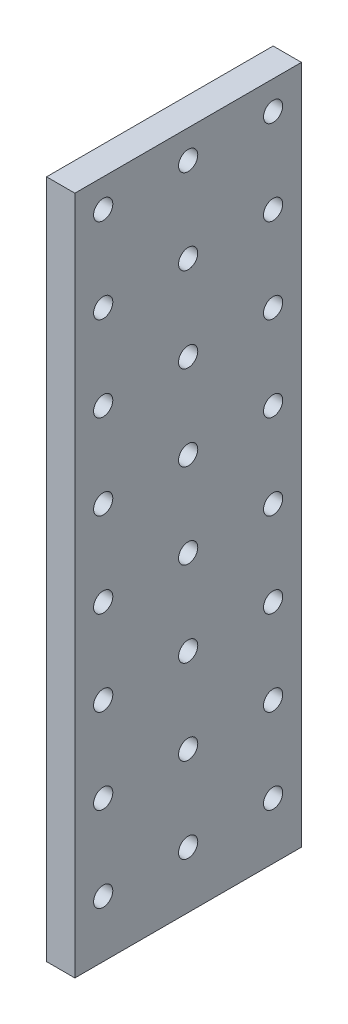
ISO-10303-21;
HEADER;
FILE_DESCRIPTION(('STEP AP214'),'2;1');
FILE_NAME('part.step','',(''),(''),'','','');
FILE_SCHEMA(('AUTOMOTIVE_DESIGN { 1 0 10303 214 1 1 1 1 }'));
ENDSEC;
DATA;
#1=APPLICATION_CONTEXT('core data for automotive mechanical design processes');
#2=APPLICATION_PROTOCOL_DEFINITION('international standard','automotive_design',2000,#1);
#3=PRODUCT_CONTEXT('',#1,'mechanical');
#4=PRODUCT('Part','Part','',(#3));
#5=PRODUCT_RELATED_PRODUCT_CATEGORY('part','',(#4));
#6=PRODUCT_DEFINITION_FORMATION('','',#4);
#7=PRODUCT_DEFINITION_CONTEXT('part definition',#1,'design');
#8=PRODUCT_DEFINITION('design','',#6,#7);
#9=PRODUCT_DEFINITION_SHAPE('','',#8);
#10=(LENGTH_UNIT() NAMED_UNIT(*) SI_UNIT(.MILLI.,.METRE.));
#11=(NAMED_UNIT(*) PLANE_ANGLE_UNIT() SI_UNIT($,.RADIAN.));
#12=(NAMED_UNIT(*) SI_UNIT($,.STERADIAN.) SOLID_ANGLE_UNIT());
#13=UNCERTAINTY_MEASURE_WITH_UNIT(LENGTH_MEASURE(1.E-05),#10,'distance_accuracy_value','');
#14=(GEOMETRIC_REPRESENTATION_CONTEXT(3) GLOBAL_UNCERTAINTY_ASSIGNED_CONTEXT((#13)) GLOBAL_UNIT_ASSIGNED_CONTEXT((#10,
#11,#12)) REPRESENTATION_CONTEXT('',''));
#15=CARTESIAN_POINT('',(0.,0.,0.));
#16=DIRECTION('',(0.,0.,1.));
#17=DIRECTION('',(1.,0.,0.));
#18=AXIS2_PLACEMENT_3D('',#15,#16,#17);
#19=CARTESIAN_POINT('',(-6.35,-76.2,25.4));
#20=DIRECTION('',(0.,0.,1.));
#21=DIRECTION('',(1.,0.,0.));
#22=AXIS2_PLACEMENT_3D('',#19,#20,#21);
#23=PLANE('',#22);
#24=DIRECTION('',(0.,-1.,0.));
#25=VECTOR('',#24,1.);
#26=CARTESIAN_POINT('',(0.,-76.2,25.4));
#27=LINE('',#26,#25);
#28=CARTESIAN_POINT('',(0.,76.2,25.4));
#29=VERTEX_POINT('',#28);
#30=CARTESIAN_POINT('',(0.,-76.2,25.4));
#31=VERTEX_POINT('',#30);
#32=EDGE_CURVE('E109',#29,#31,#27,.T.);
#33=ORIENTED_EDGE('',*,*,#32,.F.);
#34=DIRECTION('',(1.,0.,0.));
#35=VECTOR('',#34,1.);
#36=CARTESIAN_POINT('',(-6.35,76.2,25.4));
#37=LINE('',#36,#35);
#38=CARTESIAN_POINT('',(-6.35,76.2,25.4));
#39=VERTEX_POINT('',#38);
#40=EDGE_CURVE('E13',#39,#29,#37,.T.);
#41=ORIENTED_EDGE('',*,*,#40,.F.);
#42=DIRECTION('',(0.,-1.,0.));
#43=VECTOR('',#42,1.);
#44=CARTESIAN_POINT('',(-6.35,-76.2,25.4));
#45=LINE('',#44,#43);
#46=CARTESIAN_POINT('',(-6.35,-76.2,25.4));
#47=VERTEX_POINT('',#46);
#48=EDGE_CURVE('E102',#39,#47,#45,.T.);
#49=ORIENTED_EDGE('',*,*,#48,.T.);
#50=DIRECTION('',(1.,0.,0.));
#51=VECTOR('',#50,1.);
#52=CARTESIAN_POINT('',(-6.35,-76.2,25.4));
#53=LINE('',#52,#51);
#54=EDGE_CURVE('E47',#47,#31,#53,.T.);
#55=ORIENTED_EDGE('',*,*,#54,.T.);
#56=EDGE_LOOP('',(#33,#41,#49,#55));
#57=FACE_BOUND('',#56,.T.);
#58=ADVANCED_FACE('F44',(#57),#23,.T.);
#59=CARTESIAN_POINT('',(-6.35,76.2,-25.4));
#60=DIRECTION('',(0.,1.,0.));
#61=DIRECTION('',(0.,0.,1.));
#62=AXIS2_PLACEMENT_3D('',#59,#60,#61);
#63=PLANE('',#62);
#64=DIRECTION('',(0.,0.,1.));
#65=VECTOR('',#64,1.);
#66=CARTESIAN_POINT('',(0.,76.2,-25.4));
#67=LINE('',#66,#65);
#68=CARTESIAN_POINT('',(0.,76.2,-25.4));
#69=VERTEX_POINT('',#68);
#70=EDGE_CURVE('E104',#69,#29,#67,.T.);
#71=ORIENTED_EDGE('',*,*,#70,.F.);
#72=DIRECTION('',(1.,0.,0.));
#73=VECTOR('',#72,1.);
#74=CARTESIAN_POINT('',(-6.35,76.2,-25.4));
#75=LINE('',#74,#73);
#76=CARTESIAN_POINT('',(-6.35,76.2,-25.4));
#77=VERTEX_POINT('',#76);
#78=EDGE_CURVE('E53',#77,#69,#75,.T.);
#79=ORIENTED_EDGE('',*,*,#78,.F.);
#80=DIRECTION('',(0.,0.,1.));
#81=VECTOR('',#80,1.);
#82=CARTESIAN_POINT('',(-6.35,76.2,-25.4));
#83=LINE('',#82,#81);
#84=EDGE_CURVE('E99',#77,#39,#83,.T.);
#85=ORIENTED_EDGE('',*,*,#84,.T.);
#86=ORIENTED_EDGE('',*,*,#40,.T.);
#87=EDGE_LOOP('',(#71,#79,#85,#86));
#88=FACE_BOUND('',#87,.T.);
#89=ADVANCED_FACE('F120',(#88),#63,.T.);
#90=CARTESIAN_POINT('',(-6.35,-76.2,-25.4));
#91=DIRECTION('',(0.,0.,-1.));
#92=DIRECTION('',(-1.,0.,0.));
#93=AXIS2_PLACEMENT_3D('',#90,#91,#92);
#94=PLANE('',#93);
#95=DIRECTION('',(0.,1.,0.));
#96=VECTOR('',#95,1.);
#97=CARTESIAN_POINT('',(0.,-76.2,-25.4));
#98=LINE('',#97,#96);
#99=CARTESIAN_POINT('',(0.,-76.2,-25.4));
#100=VERTEX_POINT('',#99);
#101=EDGE_CURVE('E94',#100,#69,#98,.T.);
#102=ORIENTED_EDGE('',*,*,#101,.F.);
#103=DIRECTION('',(1.,0.,0.));
#104=VECTOR('',#103,1.);
#105=CARTESIAN_POINT('',(-6.35,-76.2,-25.4));
#106=LINE('',#105,#104);
#107=CARTESIAN_POINT('',(-6.35,-76.2,-25.4));
#108=VERTEX_POINT('',#107);
#109=EDGE_CURVE('E89',#108,#100,#106,.T.);
#110=ORIENTED_EDGE('',*,*,#109,.F.);
#111=DIRECTION('',(0.,1.,0.));
#112=VECTOR('',#111,1.);
#113=CARTESIAN_POINT('',(-6.35,-76.2,-25.4));
#114=LINE('',#113,#112);
#115=EDGE_CURVE('E92',#108,#77,#114,.T.);
#116=ORIENTED_EDGE('',*,*,#115,.T.);
#117=ORIENTED_EDGE('',*,*,#78,.T.);
#118=EDGE_LOOP('',(#102,#110,#116,#117));
#119=FACE_BOUND('',#118,.T.);
#120=ADVANCED_FACE('F91',(#119),#94,.T.);
#121=CARTESIAN_POINT('',(-6.35,-76.2,-25.4));
#122=DIRECTION('',(0.,-1.,0.));
#123=DIRECTION('',(0.,0.,-1.));
#124=AXIS2_PLACEMENT_3D('',#121,#122,#123);
#125=PLANE('',#124);
#126=DIRECTION('',(0.,0.,-1.));
#127=VECTOR('',#126,1.);
#128=CARTESIAN_POINT('',(0.,-76.2,-25.4));
#129=LINE('',#128,#127);
#130=EDGE_CURVE('E112',#31,#100,#129,.T.);
#131=ORIENTED_EDGE('',*,*,#130,.F.);
#132=ORIENTED_EDGE('',*,*,#54,.F.);
#133=DIRECTION('',(0.,0.,-1.));
#134=VECTOR('',#133,1.);
#135=CARTESIAN_POINT('',(-6.35,-76.2,-25.4));
#136=LINE('',#135,#134);
#137=EDGE_CURVE('E98',#47,#108,#136,.T.);
#138=ORIENTED_EDGE('',*,*,#137,.T.);
#139=ORIENTED_EDGE('',*,*,#109,.T.);
#140=EDGE_LOOP('',(#131,#132,#138,#139));
#141=FACE_BOUND('',#140,.T.);
#142=ADVANCED_FACE('F101',(#141),#125,.T.);
#143=CARTESIAN_POINT('',(-6.35,0.,0.));
#144=DIRECTION('',(1.,0.,0.));
#145=DIRECTION('',(0.,0.,-1.));
#146=AXIS2_PLACEMENT_3D('',#143,#144,#145);
#147=PLANE('',#146);
#148=CARTESIAN_POINT('',(-6.35,-63.5,-1.40165656858926E-12));
#149=DIRECTION('',(1.,0.,0.));
#150=DIRECTION('',(0.,0.,-1.));
#151=AXIS2_PLACEMENT_3D('',#148,#149,#150);
#152=CIRCLE('',#151,2.15265);
#153=CARTESIAN_POINT('',(-6.35,-63.5,-2.1526500000014));
#154=VERTEX_POINT('',#153);
#155=EDGE_CURVE('E293',#154,#154,#152,.T.);
#156=ORIENTED_EDGE('',*,*,#155,.T.);
#157=EDGE_LOOP('',(#156));
#158=FACE_BOUND('',#157,.T.);
#159=CARTESIAN_POINT('',(-6.35,-63.5,-19.0500000000014));
#160=DIRECTION('',(1.,0.,0.));
#161=DIRECTION('',(0.,0.,-1.));
#162=AXIS2_PLACEMENT_3D('',#159,#160,#161);
#163=CIRCLE('',#162,2.15265);
#164=CARTESIAN_POINT('',(-6.35,-63.5,-21.2026500000014));
#165=VERTEX_POINT('',#164);
#166=EDGE_CURVE('E281',#165,#165,#163,.T.);
#167=ORIENTED_EDGE('',*,*,#166,.T.);
#168=EDGE_LOOP('',(#167));
#169=FACE_BOUND('',#168,.T.);
#170=CARTESIAN_POINT('',(-6.35,50.8,19.0499999999998));
#171=DIRECTION('',(1.,0.,0.));
#172=DIRECTION('',(0.,0.,-1.));
#173=AXIS2_PLACEMENT_3D('',#170,#171,#172);
#174=CIRCLE('',#173,2.15265);
#175=CARTESIAN_POINT('',(-6.35,50.8,16.8973499999998));
#176=VERTEX_POINT('',#175);
#177=EDGE_CURVE('E288',#176,#176,#174,.T.);
#178=ORIENTED_EDGE('',*,*,#177,.T.);
#179=EDGE_LOOP('',(#178));
#180=FACE_BOUND('',#179,.T.);
#181=CARTESIAN_POINT('',(-6.35,-44.45,-19.0500000000012));
#182=DIRECTION('',(1.,0.,0.));
#183=DIRECTION('',(0.,0.,-1.));
#184=AXIS2_PLACEMENT_3D('',#181,#182,#183);
#185=CIRCLE('',#184,2.15265);
#186=CARTESIAN_POINT('',(-6.35,-44.45,-21.2026500000012));
#187=VERTEX_POINT('',#186);
#188=EDGE_CURVE('E311',#187,#187,#185,.T.);
#189=ORIENTED_EDGE('',*,*,#188,.T.);
#190=EDGE_LOOP('',(#189));
#191=FACE_BOUND('',#190,.T.);
#192=CARTESIAN_POINT('',(-6.35,-44.45,-1.20042864537595E-12));
#193=DIRECTION('',(1.,0.,0.));
#194=DIRECTION('',(0.,0.,-1.));
#195=AXIS2_PLACEMENT_3D('',#192,#193,#194);
#196=CIRCLE('',#195,2.15265);
#197=CARTESIAN_POINT('',(-6.35,-44.45,-2.1526500000012));
#198=VERTEX_POINT('',#197);
#199=EDGE_CURVE('E305',#198,#198,#196,.T.);
#200=ORIENTED_EDGE('',*,*,#199,.T.);
#201=EDGE_LOOP('',(#200));
#202=FACE_BOUND('',#201,.T.);
#203=CARTESIAN_POINT('',(-6.35,-25.4,-19.050000000001));
#204=DIRECTION('',(1.,0.,0.));
#205=DIRECTION('',(0.,0.,-1.));
#206=AXIS2_PLACEMENT_3D('',#203,#204,#205);
#207=CIRCLE('',#206,2.15265);
#208=CARTESIAN_POINT('',(-6.35,-25.4,-21.202650000001));
#209=VERTEX_POINT('',#208);
#210=EDGE_CURVE('E298',#209,#209,#207,.T.);
#211=ORIENTED_EDGE('',*,*,#210,.T.);
#212=EDGE_LOOP('',(#211));
#213=FACE_BOUND('',#212,.T.);
#214=CARTESIAN_POINT('',(-6.35,31.75,19.0499999999996));
#215=DIRECTION('',(1.,0.,0.));
#216=DIRECTION('',(0.,0.,-1.));
#217=AXIS2_PLACEMENT_3D('',#214,#215,#216);
#218=CIRCLE('',#217,2.15265);
#219=CARTESIAN_POINT('',(-6.35,31.75,16.8973499999996));
#220=VERTEX_POINT('',#219);
#221=EDGE_CURVE('E242',#220,#220,#218,.T.);
#222=ORIENTED_EDGE('',*,*,#221,.T.);
#223=EDGE_LOOP('',(#222));
#224=FACE_BOUND('',#223,.T.);
#225=CARTESIAN_POINT('',(-6.35,12.7,19.0499999999994));
#226=DIRECTION('',(1.,0.,0.));
#227=DIRECTION('',(0.,0.,-1.));
#228=AXIS2_PLACEMENT_3D('',#225,#226,#227);
#229=CIRCLE('',#228,2.15265);
#230=CARTESIAN_POINT('',(-6.35,12.7,16.8973499999994));
#231=VERTEX_POINT('',#230);
#232=EDGE_CURVE('E247',#231,#231,#229,.T.);
#233=ORIENTED_EDGE('',*,*,#232,.T.);
#234=EDGE_LOOP('',(#233));
#235=FACE_BOUND('',#234,.T.);
#236=CARTESIAN_POINT('',(-6.35,-6.34999999999998,19.0499999999992));
#237=DIRECTION('',(1.,0.,0.));
#238=DIRECTION('',(0.,0.,-1.));
#239=AXIS2_PLACEMENT_3D('',#236,#237,#238);
#240=CIRCLE('',#239,2.15265);
#241=CARTESIAN_POINT('',(-6.35,-6.34999999999998,16.8973499999992));
#242=VERTEX_POINT('',#241);
#243=EDGE_CURVE('E257',#242,#242,#240,.T.);
#244=ORIENTED_EDGE('',*,*,#243,.T.);
#245=EDGE_LOOP('',(#244));
#246=FACE_BOUND('',#245,.T.);
#247=CARTESIAN_POINT('',(-6.35,-25.4,19.049999999999));
#248=DIRECTION('',(1.,0.,0.));
#249=DIRECTION('',(0.,0.,-1.));
#250=AXIS2_PLACEMENT_3D('',#247,#248,#249);
#251=CIRCLE('',#250,2.15265);
#252=CARTESIAN_POINT('',(-6.35,-25.4,16.897349999999));
#253=VERTEX_POINT('',#252);
#254=EDGE_CURVE('E263',#253,#253,#251,.T.);
#255=ORIENTED_EDGE('',*,*,#254,.T.);
#256=EDGE_LOOP('',(#255));
#257=FACE_BOUND('',#256,.T.);
#258=CARTESIAN_POINT('',(-6.35,-44.45,19.0499999999988));
#259=DIRECTION('',(1.,0.,0.));
#260=DIRECTION('',(0.,0.,-1.));
#261=AXIS2_PLACEMENT_3D('',#258,#259,#260);
#262=CIRCLE('',#261,2.15265);
#263=CARTESIAN_POINT('',(-6.35,-44.45,16.8973499999988));
#264=VERTEX_POINT('',#263);
#265=EDGE_CURVE('E269',#264,#264,#262,.T.);
#266=ORIENTED_EDGE('',*,*,#265,.T.);
#267=EDGE_LOOP('',(#266));
#268=FACE_BOUND('',#267,.T.);
#269=CARTESIAN_POINT('',(-6.35,-63.5,19.0499999999986));
#270=DIRECTION('',(1.,0.,0.));
#271=DIRECTION('',(0.,0.,-1.));
#272=AXIS2_PLACEMENT_3D('',#269,#270,#271);
#273=CIRCLE('',#272,2.15265);
#274=CARTESIAN_POINT('',(-6.35,-63.5,16.8973499999986));
#275=VERTEX_POINT('',#274);
#276=EDGE_CURVE('E275',#275,#275,#273,.T.);
#277=ORIENTED_EDGE('',*,*,#276,.T.);
#278=EDGE_LOOP('',(#277));
#279=FACE_BOUND('',#278,.T.);
#280=CARTESIAN_POINT('',(-6.35,69.85,0.));
#281=DIRECTION('',(1.,0.,0.));
#282=DIRECTION('',(0.,0.,-1.));
#283=AXIS2_PLACEMENT_3D('',#280,#281,#282);
#284=CIRCLE('',#283,2.15265);
#285=CARTESIAN_POINT('',(-6.35,69.85,-2.15265));
#286=VERTEX_POINT('',#285);
#287=EDGE_CURVE('E352',#286,#286,#284,.T.);
#288=ORIENTED_EDGE('',*,*,#287,.T.);
#289=EDGE_LOOP('',(#288));
#290=FACE_BOUND('',#289,.T.);
#291=CARTESIAN_POINT('',(-6.35,69.85,-19.05));
#292=DIRECTION('',(1.,0.,0.));
#293=DIRECTION('',(0.,0.,-1.));
#294=AXIS2_PLACEMENT_3D('',#291,#292,#293);
#295=CIRCLE('',#294,2.15265);
#296=CARTESIAN_POINT('',(-6.35,69.85,-21.20265));
#297=VERTEX_POINT('',#296);
#298=EDGE_CURVE('E359',#297,#297,#295,.T.);
#299=ORIENTED_EDGE('',*,*,#298,.T.);
#300=EDGE_LOOP('',(#299));
#301=FACE_BOUND('',#300,.T.);
#302=CARTESIAN_POINT('',(-6.35,31.75,-4.02455846426619E-13));
#303=DIRECTION('',(1.,0.,0.));
#304=DIRECTION('',(0.,0.,-1.));
#305=AXIS2_PLACEMENT_3D('',#302,#303,#304);
#306=CIRCLE('',#305,2.15265);
#307=CARTESIAN_POINT('',(-6.35,31.75,-2.1526500000004));
#308=VERTEX_POINT('',#307);
#309=EDGE_CURVE('E373',#308,#308,#306,.T.);
#310=ORIENTED_EDGE('',*,*,#309,.T.);
#311=EDGE_LOOP('',(#310));
#312=FACE_BOUND('',#311,.T.);
#313=CARTESIAN_POINT('',(-6.35,50.8,-19.0500000000002));
#314=DIRECTION('',(1.,0.,0.));
#315=DIRECTION('',(0.,0.,-1.));
#316=AXIS2_PLACEMENT_3D('',#313,#314,#315);
#317=CIRCLE('',#316,2.15265);
#318=CARTESIAN_POINT('',(-6.35,50.8,-21.2026500000002));
#319=VERTEX_POINT('',#318);
#320=EDGE_CURVE('E366',#319,#319,#317,.T.);
#321=ORIENTED_EDGE('',*,*,#320,.T.);
#322=EDGE_LOOP('',(#321));
#323=FACE_BOUND('',#322,.T.);
#324=CARTESIAN_POINT('',(-6.35,50.8,-2.04697370165263E-13));
#325=DIRECTION('',(1.,0.,0.));
#326=DIRECTION('',(0.,0.,-1.));
#327=AXIS2_PLACEMENT_3D('',#324,#325,#326);
#328=CIRCLE('',#327,2.15265);
#329=CARTESIAN_POINT('',(-6.35,50.8,-2.15265000000021));
#330=VERTEX_POINT('',#329);
#331=EDGE_CURVE('E365',#330,#330,#328,.T.);
#332=ORIENTED_EDGE('',*,*,#331,.T.);
#333=EDGE_LOOP('',(#332));
#334=FACE_BOUND('',#333,.T.);
#335=CARTESIAN_POINT('',(-6.35,31.75,-19.0500000000004));
#336=DIRECTION('',(1.,0.,0.));
#337=DIRECTION('',(0.,0.,-1.));
#338=AXIS2_PLACEMENT_3D('',#335,#336,#337);
#339=CIRCLE('',#338,2.15265);
#340=CARTESIAN_POINT('',(-6.35,31.75,-21.2026500000004));
#341=VERTEX_POINT('',#340);
#342=EDGE_CURVE('E316',#341,#341,#339,.T.);
#343=ORIENTED_EDGE('',*,*,#342,.T.);
#344=EDGE_LOOP('',(#343));
#345=FACE_BOUND('',#344,.T.);
#346=CARTESIAN_POINT('',(-6.35,12.7,-6.03683769639929E-13));
#347=DIRECTION('',(1.,0.,0.));
#348=DIRECTION('',(0.,0.,-1.));
#349=AXIS2_PLACEMENT_3D('',#346,#347,#348);
#350=CIRCLE('',#349,2.15265);
#351=CARTESIAN_POINT('',(-6.35,12.7,-2.1526500000006));
#352=VERTEX_POINT('',#351);
#353=EDGE_CURVE('E323',#352,#352,#350,.T.);
#354=ORIENTED_EDGE('',*,*,#353,.T.);
#355=EDGE_LOOP('',(#354));
#356=FACE_BOUND('',#355,.T.);
#357=CARTESIAN_POINT('',(-6.35,12.7,-19.0500000000006));
#358=DIRECTION('',(1.,0.,0.));
#359=DIRECTION('',(0.,0.,-1.));
#360=AXIS2_PLACEMENT_3D('',#357,#358,#359);
#361=CIRCLE('',#360,2.15265);
#362=CARTESIAN_POINT('',(-6.35,12.7,-21.2026500000006));
#363=VERTEX_POINT('',#362);
#364=EDGE_CURVE('E329',#363,#363,#361,.T.);
#365=ORIENTED_EDGE('',*,*,#364,.T.);
#366=EDGE_LOOP('',(#365));
#367=FACE_BOUND('',#366,.T.);
#368=CARTESIAN_POINT('',(-6.35,-25.4,-1.00267016911459E-12));
#369=DIRECTION('',(1.,0.,0.));
#370=DIRECTION('',(0.,0.,-1.));
#371=AXIS2_PLACEMENT_3D('',#368,#369,#370);
#372=CIRCLE('',#371,2.15265);
#373=CARTESIAN_POINT('',(-6.35,-25.4,-2.152650000001));
#374=VERTEX_POINT('',#373);
#375=EDGE_CURVE('E343',#374,#374,#372,.T.);
#376=ORIENTED_EDGE('',*,*,#375,.T.);
#377=EDGE_LOOP('',(#376));
#378=FACE_BOUND('',#377,.T.);
#379=CARTESIAN_POINT('',(-6.35,-6.34999999999998,-19.0500000000008));
#380=DIRECTION('',(1.,0.,0.));
#381=DIRECTION('',(0.,0.,-1.));
#382=AXIS2_PLACEMENT_3D('',#379,#380,#381);
#383=CIRCLE('',#382,2.15265);
#384=CARTESIAN_POINT('',(-6.35,-6.34999999999998,-21.2026500000008));
#385=VERTEX_POINT('',#384);
#386=EDGE_CURVE('E336',#385,#385,#383,.T.);
#387=ORIENTED_EDGE('',*,*,#386,.T.);
#388=EDGE_LOOP('',(#387));
#389=FACE_BOUND('',#388,.T.);
#390=CARTESIAN_POINT('',(-6.35,-6.34999999999998,-8.01442245901285E-13));
#391=DIRECTION('',(1.,0.,0.));
#392=DIRECTION('',(0.,0.,-1.));
#393=AXIS2_PLACEMENT_3D('',#390,#391,#392);
#394=CIRCLE('',#393,2.15265);
#395=CARTESIAN_POINT('',(-6.35,-6.34999999999998,-2.1526500000008));
#396=VERTEX_POINT('',#395);
#397=EDGE_CURVE('E335',#396,#396,#394,.T.);
#398=ORIENTED_EDGE('',*,*,#397,.T.);
#399=EDGE_LOOP('',(#398));
#400=FACE_BOUND('',#399,.T.);
#401=CARTESIAN_POINT('',(-6.35,69.85,19.05));
#402=DIRECTION('',(1.,0.,0.));
#403=DIRECTION('',(0.,0.,-1.));
#404=AXIS2_PLACEMENT_3D('',#401,#402,#403);
#405=CIRCLE('',#404,2.15265);
#406=CARTESIAN_POINT('',(-6.35,69.85,16.89735));
#407=VERTEX_POINT('',#406);
#408=EDGE_CURVE('E113',#407,#407,#405,.T.);
#409=ORIENTED_EDGE('',*,*,#408,.T.);
#410=EDGE_LOOP('',(#409));
#411=FACE_BOUND('',#410,.T.);
#412=ORIENTED_EDGE('',*,*,#48,.F.);
#413=ORIENTED_EDGE('',*,*,#84,.F.);
#414=ORIENTED_EDGE('',*,*,#115,.F.);
#415=ORIENTED_EDGE('',*,*,#137,.F.);
#416=EDGE_LOOP('',(#412,#413,#414,#415));
#417=FACE_BOUND('',#416,.T.);
#418=ADVANCED_FACE('F97',(#158,#169,#180,#191,#202,#213,#224,#235,#246,#257,#268,#279,#290,#301,
#312,#323,#334,#345,#356,#367,#378,#389,#400,#411,#417),#147,.F.);
#419=CARTESIAN_POINT('',(0.,0.,0.));
#420=DIRECTION('',(1.,0.,0.));
#421=DIRECTION('',(0.,0.,-1.));
#422=AXIS2_PLACEMENT_3D('',#419,#420,#421);
#423=PLANE('',#422);
#424=CARTESIAN_POINT('',(0.,-63.5,-1.40165656858926E-12));
#425=DIRECTION('',(1.,0.,0.));
#426=DIRECTION('',(0.,0.,-1.));
#427=AXIS2_PLACEMENT_3D('',#424,#425,#426);
#428=CIRCLE('',#427,2.15265);
#429=CARTESIAN_POINT('',(0.,-63.5,-2.1526500000014));
#430=VERTEX_POINT('',#429);
#431=EDGE_CURVE('E284',#430,#430,#428,.T.);
#432=ORIENTED_EDGE('',*,*,#431,.F.);
#433=EDGE_LOOP('',(#432));
#434=FACE_BOUND('',#433,.T.);
#435=CARTESIAN_POINT('',(0.,-63.5,-19.0500000000014));
#436=DIRECTION('',(1.,0.,0.));
#437=DIRECTION('',(0.,0.,-1.));
#438=AXIS2_PLACEMENT_3D('',#435,#436,#437);
#439=CIRCLE('',#438,2.15265);
#440=CARTESIAN_POINT('',(0.,-63.5,-21.2026500000014));
#441=VERTEX_POINT('',#440);
#442=EDGE_CURVE('E285',#441,#441,#439,.T.);
#443=ORIENTED_EDGE('',*,*,#442,.F.);
#444=EDGE_LOOP('',(#443));
#445=FACE_BOUND('',#444,.T.);
#446=CARTESIAN_POINT('',(0.,50.8,19.0499999999998));
#447=DIRECTION('',(1.,0.,0.));
#448=DIRECTION('',(0.,0.,-1.));
#449=AXIS2_PLACEMENT_3D('',#446,#447,#448);
#450=CIRCLE('',#449,2.15265);
#451=CARTESIAN_POINT('',(0.,50.8,16.8973499999998));
#452=VERTEX_POINT('',#451);
#453=EDGE_CURVE('E249',#452,#452,#450,.T.);
#454=ORIENTED_EDGE('',*,*,#453,.F.);
#455=EDGE_LOOP('',(#454));
#456=FACE_BOUND('',#455,.T.);
#457=CARTESIAN_POINT('',(0.,-44.45,-19.0500000000012));
#458=DIRECTION('',(1.,0.,0.));
#459=DIRECTION('',(0.,0.,-1.));
#460=AXIS2_PLACEMENT_3D('',#457,#458,#459);
#461=CIRCLE('',#460,2.15265);
#462=CARTESIAN_POINT('',(0.,-44.45,-21.2026500000012));
#463=VERTEX_POINT('',#462);
#464=EDGE_CURVE('E295',#463,#463,#461,.T.);
#465=ORIENTED_EDGE('',*,*,#464,.F.);
#466=EDGE_LOOP('',(#465));
#467=FACE_BOUND('',#466,.T.);
#468=CARTESIAN_POINT('',(0.,-44.45,-1.20042864537595E-12));
#469=DIRECTION('',(1.,0.,0.));
#470=DIRECTION('',(0.,0.,-1.));
#471=AXIS2_PLACEMENT_3D('',#468,#469,#470);
#472=CIRCLE('',#471,2.15265);
#473=CARTESIAN_POINT('',(0.,-44.45,-2.1526500000012));
#474=VERTEX_POINT('',#473);
#475=EDGE_CURVE('E308',#474,#474,#472,.T.);
#476=ORIENTED_EDGE('',*,*,#475,.F.);
#477=EDGE_LOOP('',(#476));
#478=FACE_BOUND('',#477,.T.);
#479=CARTESIAN_POINT('',(0.,-25.4,-19.050000000001));
#480=DIRECTION('',(1.,0.,0.));
#481=DIRECTION('',(0.,0.,-1.));
#482=AXIS2_PLACEMENT_3D('',#479,#480,#481);
#483=CIRCLE('',#482,2.15265);
#484=CARTESIAN_POINT('',(0.,-25.4,-21.202650000001));
#485=VERTEX_POINT('',#484);
#486=EDGE_CURVE('E302',#485,#485,#483,.T.);
#487=ORIENTED_EDGE('',*,*,#486,.F.);
#488=EDGE_LOOP('',(#487));
#489=FACE_BOUND('',#488,.T.);
#490=CARTESIAN_POINT('',(0.,31.75,19.0499999999996));
#491=DIRECTION('',(1.,0.,0.));
#492=DIRECTION('',(0.,0.,-1.));
#493=AXIS2_PLACEMENT_3D('',#490,#491,#492);
#494=CIRCLE('',#493,2.15265);
#495=CARTESIAN_POINT('',(0.,31.75,16.8973499999996));
#496=VERTEX_POINT('',#495);
#497=EDGE_CURVE('E245',#496,#496,#494,.T.);
#498=ORIENTED_EDGE('',*,*,#497,.F.);
#499=EDGE_LOOP('',(#498));
#500=FACE_BOUND('',#499,.T.);
#501=CARTESIAN_POINT('',(0.,12.7,19.0499999999994));
#502=DIRECTION('',(1.,0.,0.));
#503=DIRECTION('',(0.,0.,-1.));
#504=AXIS2_PLACEMENT_3D('',#501,#502,#503);
#505=CIRCLE('',#504,2.15265);
#506=CARTESIAN_POINT('',(0.,12.7,16.8973499999994));
#507=VERTEX_POINT('',#506);
#508=EDGE_CURVE('E252',#507,#507,#505,.T.);
#509=ORIENTED_EDGE('',*,*,#508,.F.);
#510=EDGE_LOOP('',(#509));
#511=FACE_BOUND('',#510,.T.);
#512=CARTESIAN_POINT('',(0.,-6.34999999999998,19.0499999999992));
#513=DIRECTION('',(1.,0.,0.));
#514=DIRECTION('',(0.,0.,-1.));
#515=AXIS2_PLACEMENT_3D('',#512,#513,#514);
#516=CIRCLE('',#515,2.15265);
#517=CARTESIAN_POINT('',(0.,-6.34999999999998,16.8973499999992));
#518=VERTEX_POINT('',#517);
#519=EDGE_CURVE('E260',#518,#518,#516,.T.);
#520=ORIENTED_EDGE('',*,*,#519,.F.);
#521=EDGE_LOOP('',(#520));
#522=FACE_BOUND('',#521,.T.);
#523=CARTESIAN_POINT('',(0.,-25.4,19.049999999999));
#524=DIRECTION('',(1.,0.,0.));
#525=DIRECTION('',(0.,0.,-1.));
#526=AXIS2_PLACEMENT_3D('',#523,#524,#525);
#527=CIRCLE('',#526,2.15265);
#528=CARTESIAN_POINT('',(0.,-25.4,16.897349999999));
#529=VERTEX_POINT('',#528);
#530=EDGE_CURVE('E266',#529,#529,#527,.T.);
#531=ORIENTED_EDGE('',*,*,#530,.F.);
#532=EDGE_LOOP('',(#531));
#533=FACE_BOUND('',#532,.T.);
#534=CARTESIAN_POINT('',(0.,-44.45,19.0499999999988));
#535=DIRECTION('',(1.,0.,0.));
#536=DIRECTION('',(0.,0.,-1.));
#537=AXIS2_PLACEMENT_3D('',#534,#535,#536);
#538=CIRCLE('',#537,2.15265);
#539=CARTESIAN_POINT('',(0.,-44.45,16.8973499999988));
#540=VERTEX_POINT('',#539);
#541=EDGE_CURVE('E272',#540,#540,#538,.T.);
#542=ORIENTED_EDGE('',*,*,#541,.F.);
#543=EDGE_LOOP('',(#542));
#544=FACE_BOUND('',#543,.T.);
#545=CARTESIAN_POINT('',(0.,-63.5,19.0499999999986));
#546=DIRECTION('',(1.,0.,0.));
#547=DIRECTION('',(0.,0.,-1.));
#548=AXIS2_PLACEMENT_3D('',#545,#546,#547);
#549=CIRCLE('',#548,2.15265);
#550=CARTESIAN_POINT('',(0.,-63.5,16.8973499999986));
#551=VERTEX_POINT('',#550);
#552=EDGE_CURVE('E278',#551,#551,#549,.T.);
#553=ORIENTED_EDGE('',*,*,#552,.F.);
#554=EDGE_LOOP('',(#553));
#555=FACE_BOUND('',#554,.T.);
#556=CARTESIAN_POINT('',(0.,69.85,0.));
#557=DIRECTION('',(1.,0.,0.));
#558=DIRECTION('',(0.,0.,-1.));
#559=AXIS2_PLACEMENT_3D('',#556,#557,#558);
#560=CIRCLE('',#559,2.15265);
#561=CARTESIAN_POINT('',(0.,69.85,-2.15265));
#562=VERTEX_POINT('',#561);
#563=EDGE_CURVE('E356',#562,#562,#560,.T.);
#564=ORIENTED_EDGE('',*,*,#563,.F.);
#565=EDGE_LOOP('',(#564));
#566=FACE_BOUND('',#565,.T.);
#567=CARTESIAN_POINT('',(0.,69.85,-19.05));
#568=DIRECTION('',(1.,0.,0.));
#569=DIRECTION('',(0.,0.,-1.));
#570=AXIS2_PLACEMENT_3D('',#567,#568,#569);
#571=CIRCLE('',#570,2.15265);
#572=CARTESIAN_POINT('',(0.,69.85,-21.20265));
#573=VERTEX_POINT('',#572);
#574=EDGE_CURVE('E362',#573,#573,#571,.T.);
#575=ORIENTED_EDGE('',*,*,#574,.F.);
#576=EDGE_LOOP('',(#575));
#577=FACE_BOUND('',#576,.T.);
#578=CARTESIAN_POINT('',(0.,31.75,-4.02455846426619E-13));
#579=DIRECTION('',(1.,0.,0.));
#580=DIRECTION('',(0.,0.,-1.));
#581=AXIS2_PLACEMENT_3D('',#578,#579,#580);
#582=CIRCLE('',#581,2.15265);
#583=CARTESIAN_POINT('',(0.,31.75,-2.1526500000004));
#584=VERTEX_POINT('',#583);
#585=EDGE_CURVE('E319',#584,#584,#582,.T.);
#586=ORIENTED_EDGE('',*,*,#585,.F.);
#587=EDGE_LOOP('',(#586));
#588=FACE_BOUND('',#587,.T.);
#589=CARTESIAN_POINT('',(0.,50.8,-19.0500000000002));
#590=DIRECTION('',(1.,0.,0.));
#591=DIRECTION('',(0.,0.,-1.));
#592=AXIS2_PLACEMENT_3D('',#589,#590,#591);
#593=CIRCLE('',#592,2.15265);
#594=CARTESIAN_POINT('',(0.,50.8,-21.2026500000002));
#595=VERTEX_POINT('',#594);
#596=EDGE_CURVE('E370',#595,#595,#593,.T.);
#597=ORIENTED_EDGE('',*,*,#596,.F.);
#598=EDGE_LOOP('',(#597));
#599=FACE_BOUND('',#598,.T.);
#600=CARTESIAN_POINT('',(0.,50.8,-2.04697370165263E-13));
#601=DIRECTION('',(1.,0.,0.));
#602=DIRECTION('',(0.,0.,-1.));
#603=AXIS2_PLACEMENT_3D('',#600,#601,#602);
#604=CIRCLE('',#603,2.15265);
#605=CARTESIAN_POINT('',(0.,50.8,-2.15265000000021));
#606=VERTEX_POINT('',#605);
#607=EDGE_CURVE('E369',#606,#606,#604,.T.);
#608=ORIENTED_EDGE('',*,*,#607,.F.);
#609=EDGE_LOOP('',(#608));
#610=FACE_BOUND('',#609,.T.);
#611=CARTESIAN_POINT('',(0.,31.75,-19.0500000000004));
#612=DIRECTION('',(1.,0.,0.));
#613=DIRECTION('',(0.,0.,-1.));
#614=AXIS2_PLACEMENT_3D('',#611,#612,#613);
#615=CIRCLE('',#614,2.15265);
#616=CARTESIAN_POINT('',(0.,31.75,-21.2026500000004));
#617=VERTEX_POINT('',#616);
#618=EDGE_CURVE('E320',#617,#617,#615,.T.);
#619=ORIENTED_EDGE('',*,*,#618,.F.);
#620=EDGE_LOOP('',(#619));
#621=FACE_BOUND('',#620,.T.);
#622=CARTESIAN_POINT('',(0.,12.7,-6.03683769639929E-13));
#623=DIRECTION('',(1.,0.,0.));
#624=DIRECTION('',(0.,0.,-1.));
#625=AXIS2_PLACEMENT_3D('',#622,#623,#624);
#626=CIRCLE('',#625,2.15265);
#627=CARTESIAN_POINT('',(0.,12.7,-2.1526500000006));
#628=VERTEX_POINT('',#627);
#629=EDGE_CURVE('E326',#628,#628,#626,.T.);
#630=ORIENTED_EDGE('',*,*,#629,.F.);
#631=EDGE_LOOP('',(#630));
#632=FACE_BOUND('',#631,.T.);
#633=CARTESIAN_POINT('',(0.,12.7,-19.0500000000006));
#634=DIRECTION('',(1.,0.,0.));
#635=DIRECTION('',(0.,0.,-1.));
#636=AXIS2_PLACEMENT_3D('',#633,#634,#635);
#637=CIRCLE('',#636,2.15265);
#638=CARTESIAN_POINT('',(0.,12.7,-21.2026500000006));
#639=VERTEX_POINT('',#638);
#640=EDGE_CURVE('E332',#639,#639,#637,.T.);
#641=ORIENTED_EDGE('',*,*,#640,.F.);
#642=EDGE_LOOP('',(#641));
#643=FACE_BOUND('',#642,.T.);
#644=CARTESIAN_POINT('',(0.,-25.4,-1.00267016911459E-12));
#645=DIRECTION('',(1.,0.,0.));
#646=DIRECTION('',(0.,0.,-1.));
#647=AXIS2_PLACEMENT_3D('',#644,#645,#646);
#648=CIRCLE('',#647,2.15265);
#649=CARTESIAN_POINT('',(0.,-25.4,-2.152650000001));
#650=VERTEX_POINT('',#649);
#651=EDGE_CURVE('E301',#650,#650,#648,.T.);
#652=ORIENTED_EDGE('',*,*,#651,.F.);
#653=EDGE_LOOP('',(#652));
#654=FACE_BOUND('',#653,.T.);
#655=CARTESIAN_POINT('',(0.,-6.34999999999998,-19.0500000000008));
#656=DIRECTION('',(1.,0.,0.));
#657=DIRECTION('',(0.,0.,-1.));
#658=AXIS2_PLACEMENT_3D('',#655,#656,#657);
#659=CIRCLE('',#658,2.15265);
#660=CARTESIAN_POINT('',(0.,-6.34999999999998,-21.2026500000008));
#661=VERTEX_POINT('',#660);
#662=EDGE_CURVE('E340',#661,#661,#659,.T.);
#663=ORIENTED_EDGE('',*,*,#662,.F.);
#664=EDGE_LOOP('',(#663));
#665=FACE_BOUND('',#664,.T.);
#666=CARTESIAN_POINT('',(0.,-6.34999999999998,-8.01442245901285E-13));
#667=DIRECTION('',(1.,0.,0.));
#668=DIRECTION('',(0.,0.,-1.));
#669=AXIS2_PLACEMENT_3D('',#666,#667,#668);
#670=CIRCLE('',#669,2.15265);
#671=CARTESIAN_POINT('',(0.,-6.34999999999998,-2.1526500000008));
#672=VERTEX_POINT('',#671);
#673=EDGE_CURVE('E339',#672,#672,#670,.T.);
#674=ORIENTED_EDGE('',*,*,#673,.F.);
#675=EDGE_LOOP('',(#674));
#676=FACE_BOUND('',#675,.T.);
#677=CARTESIAN_POINT('',(0.,69.85,19.05));
#678=DIRECTION('',(1.,0.,0.));
#679=DIRECTION('',(0.,0.,-1.));
#680=AXIS2_PLACEMENT_3D('',#677,#678,#679);
#681=CIRCLE('',#680,2.15265);
#682=CARTESIAN_POINT('',(0.,69.85,16.89735));
#683=VERTEX_POINT('',#682);
#684=EDGE_CURVE('E355',#683,#683,#681,.T.);
#685=ORIENTED_EDGE('',*,*,#684,.F.);
#686=EDGE_LOOP('',(#685));
#687=FACE_BOUND('',#686,.T.);
#688=ORIENTED_EDGE('',*,*,#32,.T.);
#689=ORIENTED_EDGE('',*,*,#130,.T.);
#690=ORIENTED_EDGE('',*,*,#101,.T.);
#691=ORIENTED_EDGE('',*,*,#70,.T.);
#692=EDGE_LOOP('',(#688,#689,#690,#691));
#693=FACE_BOUND('',#692,.T.);
#694=ADVANCED_FACE('F119',(#434,#445,#456,#467,#478,#489,#500,#511,#522,#533,#544,#555,#566,
#577,#588,#599,#610,#621,#632,#643,#654,#665,#676,#687,#693),#423,.T.);
#695=CARTESIAN_POINT('',(-6.35,69.85,19.05));
#696=DIRECTION('',(1.,0.,0.));
#697=DIRECTION('',(0.,0.,-1.));
#698=AXIS2_PLACEMENT_3D('',#695,#696,#697);
#699=CYLINDRICAL_SURFACE('',#698,2.15265);
#700=ORIENTED_EDGE('',*,*,#408,.F.);
#701=EDGE_LOOP('',(#700));
#702=FACE_BOUND('',#701,.T.);
#703=ORIENTED_EDGE('',*,*,#684,.T.);
#704=EDGE_LOOP('',(#703));
#705=FACE_BOUND('',#704,.T.);
#706=ADVANCED_FACE('F138',(#702,#705),#699,.F.);
#707=CARTESIAN_POINT('',(-6.35,-6.34999999999998,-8.01442245901285E-13));
#708=DIRECTION('',(1.,0.,0.));
#709=DIRECTION('',(0.,0.,-1.));
#710=AXIS2_PLACEMENT_3D('',#707,#708,#709);
#711=CYLINDRICAL_SURFACE('',#710,2.15265);
#712=ORIENTED_EDGE('',*,*,#397,.F.);
#713=EDGE_LOOP('',(#712));
#714=FACE_BOUND('',#713,.T.);
#715=ORIENTED_EDGE('',*,*,#673,.T.);
#716=EDGE_LOOP('',(#715));
#717=FACE_BOUND('',#716,.T.);
#718=ADVANCED_FACE('F145',(#714,#717),#711,.F.);
#719=CARTESIAN_POINT('',(-6.35,-6.34999999999998,-19.0500000000008));
#720=DIRECTION('',(1.,0.,0.));
#721=DIRECTION('',(0.,0.,-1.));
#722=AXIS2_PLACEMENT_3D('',#719,#720,#721);
#723=CYLINDRICAL_SURFACE('',#722,2.15265);
#724=ORIENTED_EDGE('',*,*,#386,.F.);
#725=EDGE_LOOP('',(#724));
#726=FACE_BOUND('',#725,.T.);
#727=ORIENTED_EDGE('',*,*,#662,.T.);
#728=EDGE_LOOP('',(#727));
#729=FACE_BOUND('',#728,.T.);
#730=ADVANCED_FACE('F171',(#726,#729),#723,.F.);
#731=CARTESIAN_POINT('',(-6.35,-25.4,-1.00267016911459E-12));
#732=DIRECTION('',(1.,0.,0.));
#733=DIRECTION('',(0.,0.,-1.));
#734=AXIS2_PLACEMENT_3D('',#731,#732,#733);
#735=CYLINDRICAL_SURFACE('',#734,2.15265);
#736=ORIENTED_EDGE('',*,*,#375,.F.);
#737=EDGE_LOOP('',(#736));
#738=FACE_BOUND('',#737,.T.);
#739=ORIENTED_EDGE('',*,*,#651,.T.);
#740=EDGE_LOOP('',(#739));
#741=FACE_BOUND('',#740,.T.);
#742=ADVANCED_FACE('F173',(#738,#741),#735,.F.);
#743=CARTESIAN_POINT('',(-6.35,12.7,-19.0500000000006));
#744=DIRECTION('',(1.,0.,0.));
#745=DIRECTION('',(0.,0.,-1.));
#746=AXIS2_PLACEMENT_3D('',#743,#744,#745);
#747=CYLINDRICAL_SURFACE('',#746,2.15265);
#748=ORIENTED_EDGE('',*,*,#364,.F.);
#749=EDGE_LOOP('',(#748));
#750=FACE_BOUND('',#749,.T.);
#751=ORIENTED_EDGE('',*,*,#640,.T.);
#752=EDGE_LOOP('',(#751));
#753=FACE_BOUND('',#752,.T.);
#754=ADVANCED_FACE('F176',(#750,#753),#747,.F.);
#755=CARTESIAN_POINT('',(-6.35,12.7,-6.03683769639929E-13));
#756=DIRECTION('',(1.,0.,0.));
#757=DIRECTION('',(0.,0.,-1.));
#758=AXIS2_PLACEMENT_3D('',#755,#756,#757);
#759=CYLINDRICAL_SURFACE('',#758,2.15265);
#760=ORIENTED_EDGE('',*,*,#353,.F.);
#761=EDGE_LOOP('',(#760));
#762=FACE_BOUND('',#761,.T.);
#763=ORIENTED_EDGE('',*,*,#629,.T.);
#764=EDGE_LOOP('',(#763));
#765=FACE_BOUND('',#764,.T.);
#766=ADVANCED_FACE('F183',(#762,#765),#759,.F.);
#767=CARTESIAN_POINT('',(-6.35,31.75,-19.0500000000004));
#768=DIRECTION('',(1.,0.,0.));
#769=DIRECTION('',(0.,0.,-1.));
#770=AXIS2_PLACEMENT_3D('',#767,#768,#769);
#771=CYLINDRICAL_SURFACE('',#770,2.15265);
#772=ORIENTED_EDGE('',*,*,#342,.F.);
#773=EDGE_LOOP('',(#772));
#774=FACE_BOUND('',#773,.T.);
#775=ORIENTED_EDGE('',*,*,#618,.T.);
#776=EDGE_LOOP('',(#775));
#777=FACE_BOUND('',#776,.T.);
#778=ADVANCED_FACE('F151',(#774,#777),#771,.F.);
#779=CARTESIAN_POINT('',(-6.35,50.8,-2.04697370165263E-13));
#780=DIRECTION('',(1.,0.,0.));
#781=DIRECTION('',(0.,0.,-1.));
#782=AXIS2_PLACEMENT_3D('',#779,#780,#781);
#783=CYLINDRICAL_SURFACE('',#782,2.15265);
#784=ORIENTED_EDGE('',*,*,#331,.F.);
#785=EDGE_LOOP('',(#784));
#786=FACE_BOUND('',#785,.T.);
#787=ORIENTED_EDGE('',*,*,#607,.T.);
#788=EDGE_LOOP('',(#787));
#789=FACE_BOUND('',#788,.T.);
#790=ADVANCED_FACE('F147',(#786,#789),#783,.F.);
#791=CARTESIAN_POINT('',(-6.35,50.8,-19.0500000000002));
#792=DIRECTION('',(1.,0.,0.));
#793=DIRECTION('',(0.,0.,-1.));
#794=AXIS2_PLACEMENT_3D('',#791,#792,#793);
#795=CYLINDRICAL_SURFACE('',#794,2.15265);
#796=ORIENTED_EDGE('',*,*,#320,.F.);
#797=EDGE_LOOP('',(#796));
#798=FACE_BOUND('',#797,.T.);
#799=ORIENTED_EDGE('',*,*,#596,.T.);
#800=EDGE_LOOP('',(#799));
#801=FACE_BOUND('',#800,.T.);
#802=ADVANCED_FACE('F150',(#798,#801),#795,.F.);
#803=CARTESIAN_POINT('',(-6.35,31.75,-4.02455846426619E-13));
#804=DIRECTION('',(1.,0.,0.));
#805=DIRECTION('',(0.,0.,-1.));
#806=AXIS2_PLACEMENT_3D('',#803,#804,#805);
#807=CYLINDRICAL_SURFACE('',#806,2.15265);
#808=ORIENTED_EDGE('',*,*,#309,.F.);
#809=EDGE_LOOP('',(#808));
#810=FACE_BOUND('',#809,.T.);
#811=ORIENTED_EDGE('',*,*,#585,.T.);
#812=EDGE_LOOP('',(#811));
#813=FACE_BOUND('',#812,.T.);
#814=ADVANCED_FACE('F153',(#810,#813),#807,.F.);
#815=CARTESIAN_POINT('',(-6.35,69.85,-19.05));
#816=DIRECTION('',(1.,0.,0.));
#817=DIRECTION('',(0.,0.,-1.));
#818=AXIS2_PLACEMENT_3D('',#815,#816,#817);
#819=CYLINDRICAL_SURFACE('',#818,2.15265);
#820=ORIENTED_EDGE('',*,*,#298,.F.);
#821=EDGE_LOOP('',(#820));
#822=FACE_BOUND('',#821,.T.);
#823=ORIENTED_EDGE('',*,*,#574,.T.);
#824=EDGE_LOOP('',(#823));
#825=FACE_BOUND('',#824,.T.);
#826=ADVANCED_FACE('F156',(#822,#825),#819,.F.);
#827=CARTESIAN_POINT('',(-6.35,69.85,0.));
#828=DIRECTION('',(1.,0.,0.));
#829=DIRECTION('',(0.,0.,-1.));
#830=AXIS2_PLACEMENT_3D('',#827,#828,#829);
#831=CYLINDRICAL_SURFACE('',#830,2.15265);
#832=ORIENTED_EDGE('',*,*,#287,.F.);
#833=EDGE_LOOP('',(#832));
#834=FACE_BOUND('',#833,.T.);
#835=ORIENTED_EDGE('',*,*,#563,.T.);
#836=EDGE_LOOP('',(#835));
#837=FACE_BOUND('',#836,.T.);
#838=ADVANCED_FACE('F163',(#834,#837),#831,.F.);
#839=CARTESIAN_POINT('',(-6.35,-63.5,19.0499999999986));
#840=DIRECTION('',(1.,0.,0.));
#841=DIRECTION('',(0.,0.,-1.));
#842=AXIS2_PLACEMENT_3D('',#839,#840,#841);
#843=CYLINDRICAL_SURFACE('',#842,2.15265);
#844=ORIENTED_EDGE('',*,*,#276,.F.);
#845=EDGE_LOOP('',(#844));
#846=FACE_BOUND('',#845,.T.);
#847=ORIENTED_EDGE('',*,*,#552,.T.);
#848=EDGE_LOOP('',(#847));
#849=FACE_BOUND('',#848,.T.);
#850=ADVANCED_FACE('F167',(#846,#849),#843,.F.);
#851=CARTESIAN_POINT('',(-6.35,-44.45,19.0499999999988));
#852=DIRECTION('',(1.,0.,0.));
#853=DIRECTION('',(0.,0.,-1.));
#854=AXIS2_PLACEMENT_3D('',#851,#852,#853);
#855=CYLINDRICAL_SURFACE('',#854,2.15265);
#856=ORIENTED_EDGE('',*,*,#265,.F.);
#857=EDGE_LOOP('',(#856));
#858=FACE_BOUND('',#857,.T.);
#859=ORIENTED_EDGE('',*,*,#541,.T.);
#860=EDGE_LOOP('',(#859));
#861=FACE_BOUND('',#860,.T.);
#862=ADVANCED_FACE('F218',(#858,#861),#855,.F.);
#863=CARTESIAN_POINT('',(-6.35,-25.4,19.049999999999));
#864=DIRECTION('',(1.,0.,0.));
#865=DIRECTION('',(0.,0.,-1.));
#866=AXIS2_PLACEMENT_3D('',#863,#864,#865);
#867=CYLINDRICAL_SURFACE('',#866,2.15265);
#868=ORIENTED_EDGE('',*,*,#254,.F.);
#869=EDGE_LOOP('',(#868));
#870=FACE_BOUND('',#869,.T.);
#871=ORIENTED_EDGE('',*,*,#530,.T.);
#872=EDGE_LOOP('',(#871));
#873=FACE_BOUND('',#872,.T.);
#874=ADVANCED_FACE('F222',(#870,#873),#867,.F.);
#875=CARTESIAN_POINT('',(-6.35,-6.34999999999998,19.0499999999992));
#876=DIRECTION('',(1.,0.,0.));
#877=DIRECTION('',(0.,0.,-1.));
#878=AXIS2_PLACEMENT_3D('',#875,#876,#877);
#879=CYLINDRICAL_SURFACE('',#878,2.15265);
#880=ORIENTED_EDGE('',*,*,#243,.F.);
#881=EDGE_LOOP('',(#880));
#882=FACE_BOUND('',#881,.T.);
#883=ORIENTED_EDGE('',*,*,#519,.T.);
#884=EDGE_LOOP('',(#883));
#885=FACE_BOUND('',#884,.T.);
#886=ADVANCED_FACE('F226',(#882,#885),#879,.F.);
#887=CARTESIAN_POINT('',(-6.35,12.7,19.0499999999994));
#888=DIRECTION('',(1.,0.,0.));
#889=DIRECTION('',(0.,0.,-1.));
#890=AXIS2_PLACEMENT_3D('',#887,#888,#889);
#891=CYLINDRICAL_SURFACE('',#890,2.15265);
#892=ORIENTED_EDGE('',*,*,#232,.F.);
#893=EDGE_LOOP('',(#892));
#894=FACE_BOUND('',#893,.T.);
#895=ORIENTED_EDGE('',*,*,#508,.T.);
#896=EDGE_LOOP('',(#895));
#897=FACE_BOUND('',#896,.T.);
#898=ADVANCED_FACE('F230',(#894,#897),#891,.F.);
#899=CARTESIAN_POINT('',(-6.35,31.75,19.0499999999996));
#900=DIRECTION('',(1.,0.,0.));
#901=DIRECTION('',(0.,0.,-1.));
#902=AXIS2_PLACEMENT_3D('',#899,#900,#901);
#903=CYLINDRICAL_SURFACE('',#902,2.15265);
#904=ORIENTED_EDGE('',*,*,#221,.F.);
#905=EDGE_LOOP('',(#904));
#906=FACE_BOUND('',#905,.T.);
#907=ORIENTED_EDGE('',*,*,#497,.T.);
#908=EDGE_LOOP('',(#907));
#909=FACE_BOUND('',#908,.T.);
#910=ADVANCED_FACE('F203',(#906,#909),#903,.F.);
#911=CARTESIAN_POINT('',(-6.35,-25.4,-19.050000000001));
#912=DIRECTION('',(1.,0.,0.));
#913=DIRECTION('',(0.,0.,-1.));
#914=AXIS2_PLACEMENT_3D('',#911,#912,#913);
#915=CYLINDRICAL_SURFACE('',#914,2.15265);
#916=ORIENTED_EDGE('',*,*,#210,.F.);
#917=EDGE_LOOP('',(#916));
#918=FACE_BOUND('',#917,.T.);
#919=ORIENTED_EDGE('',*,*,#486,.T.);
#920=EDGE_LOOP('',(#919));
#921=FACE_BOUND('',#920,.T.);
#922=ADVANCED_FACE('F199',(#918,#921),#915,.F.);
#923=CARTESIAN_POINT('',(-6.35,-44.45,-1.20042864537595E-12));
#924=DIRECTION('',(1.,0.,0.));
#925=DIRECTION('',(0.,0.,-1.));
#926=AXIS2_PLACEMENT_3D('',#923,#924,#925);
#927=CYLINDRICAL_SURFACE('',#926,2.15265);
#928=ORIENTED_EDGE('',*,*,#199,.F.);
#929=EDGE_LOOP('',(#928));
#930=FACE_BOUND('',#929,.T.);
#931=ORIENTED_EDGE('',*,*,#475,.T.);
#932=EDGE_LOOP('',(#931));
#933=FACE_BOUND('',#932,.T.);
#934=ADVANCED_FACE('F195',(#930,#933),#927,.F.);
#935=CARTESIAN_POINT('',(-6.35,-44.45,-19.0500000000012));
#936=DIRECTION('',(1.,0.,0.));
#937=DIRECTION('',(0.,0.,-1.));
#938=AXIS2_PLACEMENT_3D('',#935,#936,#937);
#939=CYLINDRICAL_SURFACE('',#938,2.15265);
#940=ORIENTED_EDGE('',*,*,#188,.F.);
#941=EDGE_LOOP('',(#940));
#942=FACE_BOUND('',#941,.T.);
#943=ORIENTED_EDGE('',*,*,#464,.T.);
#944=EDGE_LOOP('',(#943));
#945=FACE_BOUND('',#944,.T.);
#946=ADVANCED_FACE('F191',(#942,#945),#939,.F.);
#947=CARTESIAN_POINT('',(-6.35,50.8,19.0499999999998));
#948=DIRECTION('',(1.,0.,0.));
#949=DIRECTION('',(0.,0.,-1.));
#950=AXIS2_PLACEMENT_3D('',#947,#948,#949);
#951=CYLINDRICAL_SURFACE('',#950,2.15265);
#952=ORIENTED_EDGE('',*,*,#177,.F.);
#953=EDGE_LOOP('',(#952));
#954=FACE_BOUND('',#953,.T.);
#955=ORIENTED_EDGE('',*,*,#453,.T.);
#956=EDGE_LOOP('',(#955));
#957=FACE_BOUND('',#956,.T.);
#958=ADVANCED_FACE('F194',(#954,#957),#951,.F.);
#959=CARTESIAN_POINT('',(-6.35,-63.5,-19.0500000000014));
#960=DIRECTION('',(1.,0.,0.));
#961=DIRECTION('',(0.,0.,-1.));
#962=AXIS2_PLACEMENT_3D('',#959,#960,#961);
#963=CYLINDRICAL_SURFACE('',#962,2.15265);
#964=ORIENTED_EDGE('',*,*,#166,.F.);
#965=EDGE_LOOP('',(#964));
#966=FACE_BOUND('',#965,.T.);
#967=ORIENTED_EDGE('',*,*,#442,.T.);
#968=EDGE_LOOP('',(#967));
#969=FACE_BOUND('',#968,.T.);
#970=ADVANCED_FACE('F208',(#966,#969),#963,.F.);
#971=CARTESIAN_POINT('',(-6.35,-63.5,-1.40165656858926E-12));
#972=DIRECTION('',(1.,0.,0.));
#973=DIRECTION('',(0.,0.,-1.));
#974=AXIS2_PLACEMENT_3D('',#971,#972,#973);
#975=CYLINDRICAL_SURFACE('',#974,2.15265);
#976=ORIENTED_EDGE('',*,*,#155,.F.);
#977=EDGE_LOOP('',(#976));
#978=FACE_BOUND('',#977,.T.);
#979=ORIENTED_EDGE('',*,*,#431,.T.);
#980=EDGE_LOOP('',(#979));
#981=FACE_BOUND('',#980,.T.);
#982=ADVANCED_FACE('F205',(#978,#981),#975,.F.);
#983=CLOSED_SHELL('',(#58,#89,#120,#142,#418,#694,#706,#718,#730,#742,#754,#766,#778,#790,#802,
#814,#826,#838,#850,#862,#874,#886,#898,#910,#922,#934,#946,#958,#970,#982));
#984=MANIFOLD_SOLID_BREP('B2',#983);
#985=ADVANCED_BREP_SHAPE_REPRESENTATION('',(#18,#984),#14);
#986=SHAPE_DEFINITION_REPRESENTATION(#9,#985);
ENDSEC;
END-ISO-10303-21;
